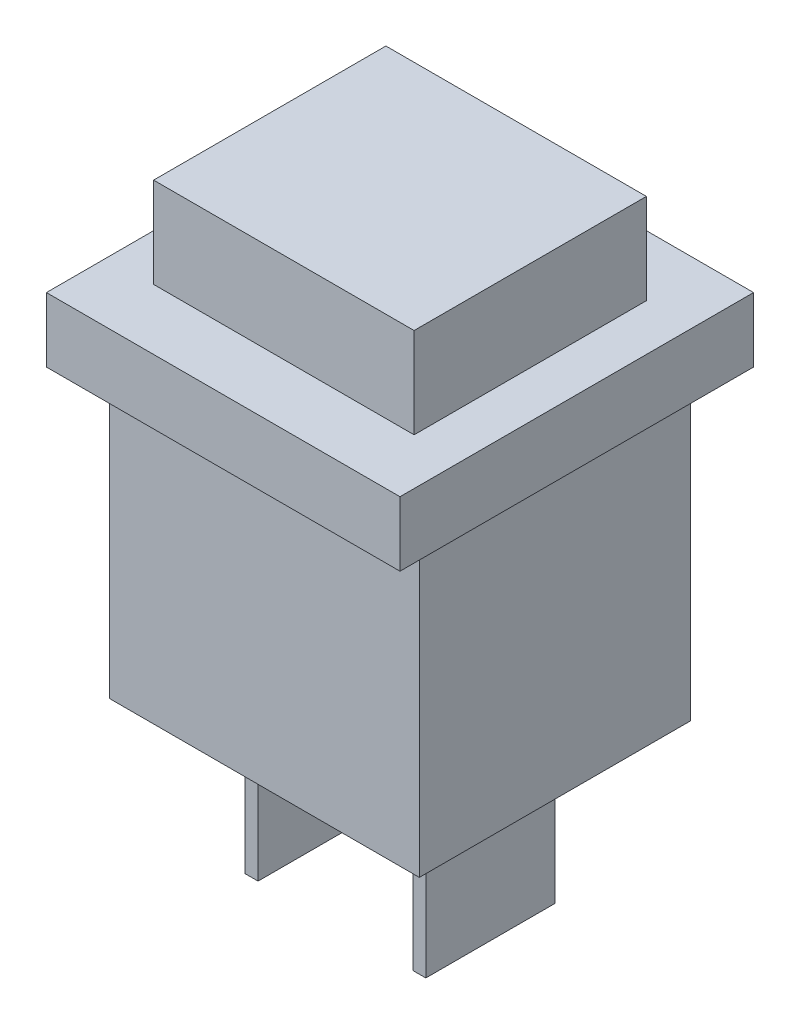
ISO-10303-21;
HEADER;
FILE_DESCRIPTION(('STEP AP214'),'2;1');
FILE_NAME('part.step','',(''),(''),'','','');
FILE_SCHEMA(('AUTOMOTIVE_DESIGN { 1 0 10303 214 1 1 1 1 }'));
ENDSEC;
DATA;
#1=APPLICATION_CONTEXT('core data for automotive mechanical design processes');
#2=APPLICATION_PROTOCOL_DEFINITION('international standard','automotive_design',2000,#1);
#3=PRODUCT_CONTEXT('',#1,'mechanical');
#4=PRODUCT('Part','Part','',(#3));
#5=PRODUCT_RELATED_PRODUCT_CATEGORY('part','',(#4));
#6=PRODUCT_DEFINITION_FORMATION('','',#4);
#7=PRODUCT_DEFINITION_CONTEXT('part definition',#1,'design');
#8=PRODUCT_DEFINITION('design','',#6,#7);
#9=PRODUCT_DEFINITION_SHAPE('','',#8);
#10=(LENGTH_UNIT() NAMED_UNIT(*) SI_UNIT(.MILLI.,.METRE.));
#11=(NAMED_UNIT(*) PLANE_ANGLE_UNIT() SI_UNIT($,.RADIAN.));
#12=(NAMED_UNIT(*) SI_UNIT($,.STERADIAN.) SOLID_ANGLE_UNIT());
#13=UNCERTAINTY_MEASURE_WITH_UNIT(LENGTH_MEASURE(1.E-05),#10,'distance_accuracy_value','');
#14=(GEOMETRIC_REPRESENTATION_CONTEXT(3) GLOBAL_UNCERTAINTY_ASSIGNED_CONTEXT((#13)) GLOBAL_UNIT_ASSIGNED_CONTEXT((#10,
#11,#12)) REPRESENTATION_CONTEXT('',''));
#15=CARTESIAN_POINT('',(0.,0.,0.));
#16=DIRECTION('',(0.,0.,1.));
#17=DIRECTION('',(1.,0.,0.));
#18=AXIS2_PLACEMENT_3D('',#15,#16,#17);
#19=CARTESIAN_POINT('',(0.953422813249566,17.5,-9.75000000000022));
#20=DIRECTION('',(1.,0.,0.));
#21=DIRECTION('',(0.,0.,-1.));
#22=AXIS2_PLACEMENT_3D('',#19,#20,#21);
#23=PLANE('',#22);
#24=DIRECTION('',(0.,0.,1.));
#25=VECTOR('',#24,1.);
#26=CARTESIAN_POINT('',(0.953422813249566,14.,-9.75000000000022));
#27=LINE('',#26,#25);
#28=CARTESIAN_POINT('',(0.953422813249566,14.,-9.75000000000022));
#29=VERTEX_POINT('',#28);
#30=CARTESIAN_POINT('',(0.953422813249567,14.,-0.749999999999774));
#31=VERTEX_POINT('',#30);
#32=EDGE_CURVE('E107',#29,#31,#27,.T.);
#33=ORIENTED_EDGE('',*,*,#32,.T.);
#34=DIRECTION('',(0.,-1.,0.));
#35=VECTOR('',#34,1.);
#36=CARTESIAN_POINT('',(0.953422813249567,17.5,-0.749999999999774));
#37=LINE('',#36,#35);
#38=CARTESIAN_POINT('',(0.953422813249567,17.5,-0.749999999999774));
#39=VERTEX_POINT('',#38);
#40=EDGE_CURVE('E12',#39,#31,#37,.T.);
#41=ORIENTED_EDGE('',*,*,#40,.F.);
#42=DIRECTION('',(0.,0.,1.));
#43=VECTOR('',#42,1.);
#44=CARTESIAN_POINT('',(0.953422813249566,17.5,-9.75000000000022));
#45=LINE('',#44,#43);
#46=CARTESIAN_POINT('',(0.953422813249566,17.5,-9.75000000000022));
#47=VERTEX_POINT('',#46);
#48=EDGE_CURVE('E95',#47,#39,#45,.T.);
#49=ORIENTED_EDGE('',*,*,#48,.F.);
#50=DIRECTION('',(0.,-1.,0.));
#51=VECTOR('',#50,1.);
#52=CARTESIAN_POINT('',(0.953422813249566,17.5,-9.75000000000022));
#53=LINE('',#52,#51);
#54=EDGE_CURVE('E103',#47,#29,#53,.T.);
#55=ORIENTED_EDGE('',*,*,#54,.T.);
#56=EDGE_LOOP('',(#33,#41,#49,#55));
#57=FACE_BOUND('',#56,.T.);
#58=ADVANCED_FACE('F44',(#57),#23,.F.);
#59=CARTESIAN_POINT('',(0.953422813249567,17.5,-0.749999999999774));
#60=DIRECTION('',(0.,0.,-1.));
#61=DIRECTION('',(-1.,0.,0.));
#62=AXIS2_PLACEMENT_3D('',#59,#60,#61);
#63=PLANE('',#62);
#64=DIRECTION('',(1.,0.,0.));
#65=VECTOR('',#64,1.);
#66=CARTESIAN_POINT('',(0.953422813249567,14.,-0.749999999999774));
#67=LINE('',#66,#65);
#68=CARTESIAN_POINT('',(11.0465771867504,14.,-0.749999999999775));
#69=VERTEX_POINT('',#68);
#70=EDGE_CURVE('E99',#31,#69,#67,.T.);
#71=ORIENTED_EDGE('',*,*,#70,.T.);
#72=DIRECTION('',(0.,-1.,0.));
#73=VECTOR('',#72,1.);
#74=CARTESIAN_POINT('',(11.0465771867504,17.5,-0.749999999999775));
#75=LINE('',#74,#73);
#76=CARTESIAN_POINT('',(11.0465771867504,17.5,-0.749999999999775));
#77=VERTEX_POINT('',#76);
#78=EDGE_CURVE('E52',#77,#69,#75,.T.);
#79=ORIENTED_EDGE('',*,*,#78,.F.);
#80=DIRECTION('',(1.,0.,0.));
#81=VECTOR('',#80,1.);
#82=CARTESIAN_POINT('',(0.953422813249567,17.5,-0.749999999999774));
#83=LINE('',#82,#81);
#84=EDGE_CURVE('E90',#39,#77,#83,.T.);
#85=ORIENTED_EDGE('',*,*,#84,.F.);
#86=ORIENTED_EDGE('',*,*,#40,.T.);
#87=EDGE_LOOP('',(#71,#79,#85,#86));
#88=FACE_BOUND('',#87,.T.);
#89=ADVANCED_FACE('F98',(#88),#63,.F.);
#90=CARTESIAN_POINT('',(11.0465771867504,17.5,-9.75000000000022));
#91=DIRECTION('',(-1.,0.,0.));
#92=DIRECTION('',(0.,0.,1.));
#93=AXIS2_PLACEMENT_3D('',#90,#91,#92);
#94=PLANE('',#93);
#95=DIRECTION('',(0.,0.,-1.));
#96=VECTOR('',#95,1.);
#97=CARTESIAN_POINT('',(11.0465771867504,14.,-9.75000000000022));
#98=LINE('',#97,#96);
#99=CARTESIAN_POINT('',(11.0465771867504,14.,-9.75000000000022));
#100=VERTEX_POINT('',#99);
#101=EDGE_CURVE('E77',#69,#100,#98,.T.);
#102=ORIENTED_EDGE('',*,*,#101,.T.);
#103=DIRECTION('',(0.,-1.,0.));
#104=VECTOR('',#103,1.);
#105=CARTESIAN_POINT('',(11.0465771867504,17.5,-9.75000000000022));
#106=LINE('',#105,#104);
#107=CARTESIAN_POINT('',(11.0465771867504,17.5,-9.75000000000022));
#108=VERTEX_POINT('',#107);
#109=EDGE_CURVE('E100',#108,#100,#106,.T.);
#110=ORIENTED_EDGE('',*,*,#109,.F.);
#111=DIRECTION('',(0.,0.,-1.));
#112=VECTOR('',#111,1.);
#113=CARTESIAN_POINT('',(11.0465771867504,17.5,-9.75000000000022));
#114=LINE('',#113,#112);
#115=EDGE_CURVE('E93',#77,#108,#114,.T.);
#116=ORIENTED_EDGE('',*,*,#115,.F.);
#117=ORIENTED_EDGE('',*,*,#78,.T.);
#118=EDGE_LOOP('',(#102,#110,#116,#117));
#119=FACE_BOUND('',#118,.T.);
#120=ADVANCED_FACE('F101',(#119),#94,.F.);
#121=CARTESIAN_POINT('',(0.953422813249566,17.5,-9.75000000000022));
#122=DIRECTION('',(0.,0.,1.));
#123=DIRECTION('',(1.,0.,0.));
#124=AXIS2_PLACEMENT_3D('',#121,#122,#123);
#125=PLANE('',#124);
#126=DIRECTION('',(-1.,0.,0.));
#127=VECTOR('',#126,1.);
#128=CARTESIAN_POINT('',(0.953422813249566,14.,-9.75000000000022));
#129=LINE('',#128,#127);
#130=EDGE_CURVE('E83',#100,#29,#129,.T.);
#131=ORIENTED_EDGE('',*,*,#130,.T.);
#132=ORIENTED_EDGE('',*,*,#54,.F.);
#133=DIRECTION('',(-1.,0.,0.));
#134=VECTOR('',#133,1.);
#135=CARTESIAN_POINT('',(0.953422813249566,17.5,-9.75000000000022));
#136=LINE('',#135,#134);
#137=EDGE_CURVE('E60',#108,#47,#136,.T.);
#138=ORIENTED_EDGE('',*,*,#137,.F.);
#139=ORIENTED_EDGE('',*,*,#109,.T.);
#140=EDGE_LOOP('',(#131,#132,#138,#139));
#141=FACE_BOUND('',#140,.T.);
#142=ADVANCED_FACE('F114',(#141),#125,.F.);
#143=CARTESIAN_POINT('',(0.,17.5,0.));
#144=DIRECTION('',(0.,1.,0.));
#145=DIRECTION('',(0.,0.,1.));
#146=AXIS2_PLACEMENT_3D('',#143,#144,#145);
#147=PLANE('',#146);
#148=ORIENTED_EDGE('',*,*,#48,.T.);
#149=ORIENTED_EDGE('',*,*,#84,.T.);
#150=ORIENTED_EDGE('',*,*,#115,.T.);
#151=ORIENTED_EDGE('',*,*,#137,.T.);
#152=EDGE_LOOP('',(#148,#149,#150,#151));
#153=FACE_BOUND('',#152,.T.);
#154=ADVANCED_FACE('F91',(#153),#147,.T.);
#155=CARTESIAN_POINT('',(0.,14.,0.));
#156=DIRECTION('',(0.,1.,0.));
#157=DIRECTION('',(0.,0.,1.));
#158=AXIS2_PLACEMENT_3D('',#155,#156,#157);
#159=PLANE('',#158);
#160=ORIENTED_EDGE('',*,*,#32,.F.);
#161=ORIENTED_EDGE('',*,*,#130,.F.);
#162=ORIENTED_EDGE('',*,*,#101,.F.);
#163=ORIENTED_EDGE('',*,*,#70,.F.);
#164=EDGE_LOOP('',(#160,#161,#162,#163));
#165=FACE_BOUND('',#164,.T.);
#166=ADVANCED_FACE('F117',(#165),#159,.F.);
#167=CLOSED_SHELL('',(#58,#89,#120,#142,#154,#166));
#168=MANIFOLD_SOLID_BREP('B2',#167);
#169=CARTESIAN_POINT('',(0.,0.,0.));
#170=DIRECTION('',(0.,-1.,0.));
#171=DIRECTION('',(0.,0.,-1.));
#172=AXIS2_PLACEMENT_3D('',#169,#170,#171);
#173=PLANE('',#172);
#174=DIRECTION('',(0.,0.,1.));
#175=VECTOR('',#174,1.);
#176=CARTESIAN_POINT('',(0.,0.,0.));
#177=LINE('',#176,#175);
#178=CARTESIAN_POINT('',(0.,0.,-10.5));
#179=VERTEX_POINT('',#178);
#180=CARTESIAN_POINT('',(0.,0.,0.));
#181=VERTEX_POINT('',#180);
#182=EDGE_CURVE('E368',#179,#181,#177,.T.);
#183=ORIENTED_EDGE('',*,*,#182,.F.);
#184=DIRECTION('',(-1.,0.,0.));
#185=VECTOR('',#184,1.);
#186=CARTESIAN_POINT('',(0.,0.,-10.5));
#187=LINE('',#186,#185);
#188=CARTESIAN_POINT('',(12.,0.,-10.5));
#189=VERTEX_POINT('',#188);
#190=EDGE_CURVE('E373',#189,#179,#187,.T.);
#191=ORIENTED_EDGE('',*,*,#190,.F.);
#192=DIRECTION('',(0.,0.,-1.));
#193=VECTOR('',#192,1.);
#194=CARTESIAN_POINT('',(12.,0.,0.));
#195=LINE('',#194,#193);
#196=CARTESIAN_POINT('',(12.,0.,0.));
#197=VERTEX_POINT('',#196);
#198=EDGE_CURVE('E387',#197,#189,#195,.T.);
#199=ORIENTED_EDGE('',*,*,#198,.F.);
#200=DIRECTION('',(1.,0.,0.));
#201=VECTOR('',#200,1.);
#202=CARTESIAN_POINT('',(0.,0.,0.));
#203=LINE('',#202,#201);
#204=EDGE_CURVE('E385',#181,#197,#203,.T.);
#205=ORIENTED_EDGE('',*,*,#204,.F.);
#206=EDGE_LOOP('',(#183,#191,#199,#205));
#207=FACE_BOUND('',#206,.T.);
#208=DIRECTION('',(1.,0.,0.));
#209=VECTOR('',#208,1.);
#210=CARTESIAN_POINT('',(9.,0.,-7.75));
#211=LINE('',#210,#209);
#212=CARTESIAN_POINT('',(9.,0.,-7.75));
#213=VERTEX_POINT('',#212);
#214=CARTESIAN_POINT('',(9.5,0.,-7.75));
#215=VERTEX_POINT('',#214);
#216=EDGE_CURVE('E310',#213,#215,#211,.T.);
#217=ORIENTED_EDGE('',*,*,#216,.F.);
#218=DIRECTION('',(0.,0.,-1.));
#219=VECTOR('',#218,1.);
#220=CARTESIAN_POINT('',(9.,0.,-2.75));
#221=LINE('',#220,#219);
#222=CARTESIAN_POINT('',(9.,0.,-2.75));
#223=VERTEX_POINT('',#222);
#224=EDGE_CURVE('E307',#223,#213,#221,.T.);
#225=ORIENTED_EDGE('',*,*,#224,.F.);
#226=DIRECTION('',(-1.,0.,0.));
#227=VECTOR('',#226,1.);
#228=CARTESIAN_POINT('',(9.,0.,-2.75));
#229=LINE('',#228,#227);
#230=CARTESIAN_POINT('',(9.5,0.,-2.75));
#231=VERTEX_POINT('',#230);
#232=EDGE_CURVE('E319',#231,#223,#229,.T.);
#233=ORIENTED_EDGE('',*,*,#232,.F.);
#234=DIRECTION('',(0.,0.,1.));
#235=VECTOR('',#234,1.);
#236=CARTESIAN_POINT('',(9.5,0.,-2.75));
#237=LINE('',#236,#235);
#238=EDGE_CURVE('E327',#215,#231,#237,.T.);
#239=ORIENTED_EDGE('',*,*,#238,.F.);
#240=EDGE_LOOP('',(#217,#225,#233,#239));
#241=FACE_BOUND('',#240,.T.);
#242=DIRECTION('',(1.,0.,0.));
#243=VECTOR('',#242,1.);
#244=CARTESIAN_POINT('',(2.5,0.,-7.75));
#245=LINE('',#244,#243);
#246=CARTESIAN_POINT('',(2.5,0.,-7.75));
#247=VERTEX_POINT('',#246);
#248=CARTESIAN_POINT('',(3.,0.,-7.75));
#249=VERTEX_POINT('',#248);
#250=EDGE_CURVE('E619',#247,#249,#245,.T.);
#251=ORIENTED_EDGE('',*,*,#250,.F.);
#252=DIRECTION('',(0.,0.,-1.));
#253=VECTOR('',#252,1.);
#254=CARTESIAN_POINT('',(2.5,0.,-2.75));
#255=LINE('',#254,#253);
#256=CARTESIAN_POINT('',(2.5,0.,-2.75));
#257=VERTEX_POINT('',#256);
#258=EDGE_CURVE('E305',#257,#247,#255,.T.);
#259=ORIENTED_EDGE('',*,*,#258,.F.);
#260=DIRECTION('',(-1.,0.,0.));
#261=VECTOR('',#260,1.);
#262=CARTESIAN_POINT('',(2.5,0.,-2.75));
#263=LINE('',#262,#261);
#264=CARTESIAN_POINT('',(3.,0.,-2.75));
#265=VERTEX_POINT('',#264);
#266=EDGE_CURVE('E301',#265,#257,#263,.T.);
#267=ORIENTED_EDGE('',*,*,#266,.F.);
#268=DIRECTION('',(0.,0.,1.));
#269=VECTOR('',#268,1.);
#270=CARTESIAN_POINT('',(3.,0.,-2.75));
#271=LINE('',#270,#269);
#272=EDGE_CURVE('E616',#249,#265,#271,.T.);
#273=ORIENTED_EDGE('',*,*,#272,.F.);
#274=EDGE_LOOP('',(#251,#259,#267,#273));
#275=FACE_BOUND('',#274,.T.);
#276=ADVANCED_FACE('F168',(#207,#241,#275),#173,.T.);
#277=CARTESIAN_POINT('',(0.,11.5,0.));
#278=DIRECTION('',(1.,0.,0.));
#279=DIRECTION('',(0.,0.,-1.));
#280=AXIS2_PLACEMENT_3D('',#277,#278,#279);
#281=PLANE('',#280);
#282=ORIENTED_EDGE('',*,*,#182,.T.);
#283=DIRECTION('',(0.,-1.,0.));
#284=VECTOR('',#283,1.);
#285=CARTESIAN_POINT('',(0.,11.5,0.));
#286=LINE('',#285,#284);
#287=CARTESIAN_POINT('',(0.,11.5,0.));
#288=VERTEX_POINT('',#287);
#289=EDGE_CURVE('E42',#288,#181,#286,.T.);
#290=ORIENTED_EDGE('',*,*,#289,.F.);
#291=DIRECTION('',(0.,0.,1.));
#292=VECTOR('',#291,1.);
#293=CARTESIAN_POINT('',(0.,11.5,0.));
#294=LINE('',#293,#292);
#295=CARTESIAN_POINT('',(0.,11.5,-10.5));
#296=VERTEX_POINT('',#295);
#297=EDGE_CURVE('E369',#296,#288,#294,.T.);
#298=ORIENTED_EDGE('',*,*,#297,.F.);
#299=DIRECTION('',(0.,-1.,0.));
#300=VECTOR('',#299,1.);
#301=CARTESIAN_POINT('',(0.,11.5,-10.5));
#302=LINE('',#301,#300);
#303=EDGE_CURVE('E382',#296,#179,#302,.T.);
#304=ORIENTED_EDGE('',*,*,#303,.T.);
#305=EDGE_LOOP('',(#282,#290,#298,#304));
#306=FACE_BOUND('',#305,.T.);
#307=ADVANCED_FACE('F170',(#306),#281,.F.);
#308=CARTESIAN_POINT('',(0.,11.5,0.));
#309=DIRECTION('',(0.,0.,-1.));
#310=DIRECTION('',(-1.,0.,0.));
#311=AXIS2_PLACEMENT_3D('',#308,#309,#310);
#312=PLANE('',#311);
#313=ORIENTED_EDGE('',*,*,#204,.T.);
#314=DIRECTION('',(0.,-1.,0.));
#315=VECTOR('',#314,1.);
#316=CARTESIAN_POINT('',(12.,11.5,0.));
#317=LINE('',#316,#315);
#318=CARTESIAN_POINT('',(12.,11.5,0.));
#319=VERTEX_POINT('',#318);
#320=EDGE_CURVE('E176',#319,#197,#317,.T.);
#321=ORIENTED_EDGE('',*,*,#320,.F.);
#322=DIRECTION('',(1.,0.,0.));
#323=VECTOR('',#322,1.);
#324=CARTESIAN_POINT('',(0.,11.5,0.));
#325=LINE('',#324,#323);
#326=EDGE_CURVE('E372',#288,#319,#325,.T.);
#327=ORIENTED_EDGE('',*,*,#326,.F.);
#328=ORIENTED_EDGE('',*,*,#289,.T.);
#329=EDGE_LOOP('',(#313,#321,#327,#328));
#330=FACE_BOUND('',#329,.T.);
#331=ADVANCED_FACE('F412',(#330),#312,.F.);
#332=CARTESIAN_POINT('',(12.,11.5,0.));
#333=DIRECTION('',(-1.,0.,0.));
#334=DIRECTION('',(0.,0.,1.));
#335=AXIS2_PLACEMENT_3D('',#332,#333,#334);
#336=PLANE('',#335);
#337=ORIENTED_EDGE('',*,*,#198,.T.);
#338=DIRECTION('',(0.,-1.,0.));
#339=VECTOR('',#338,1.);
#340=CARTESIAN_POINT('',(12.,11.5,-10.5));
#341=LINE('',#340,#339);
#342=CARTESIAN_POINT('',(12.,11.5,-10.5));
#343=VERTEX_POINT('',#342);
#344=EDGE_CURVE('E392',#343,#189,#341,.T.);
#345=ORIENTED_EDGE('',*,*,#344,.F.);
#346=DIRECTION('',(0.,0.,-1.));
#347=VECTOR('',#346,1.);
#348=CARTESIAN_POINT('',(12.,11.5,0.));
#349=LINE('',#348,#347);
#350=EDGE_CURVE('E376',#319,#343,#349,.T.);
#351=ORIENTED_EDGE('',*,*,#350,.F.);
#352=ORIENTED_EDGE('',*,*,#320,.T.);
#353=EDGE_LOOP('',(#337,#345,#351,#352));
#354=FACE_BOUND('',#353,.T.);
#355=ADVANCED_FACE('F398',(#354),#336,.F.);
#356=CARTESIAN_POINT('',(0.,11.5,-10.5));
#357=DIRECTION('',(0.,0.,1.));
#358=DIRECTION('',(1.,0.,0.));
#359=AXIS2_PLACEMENT_3D('',#356,#357,#358);
#360=PLANE('',#359);
#361=ORIENTED_EDGE('',*,*,#190,.T.);
#362=ORIENTED_EDGE('',*,*,#303,.F.);
#363=DIRECTION('',(-1.,0.,0.));
#364=VECTOR('',#363,1.);
#365=CARTESIAN_POINT('',(0.,11.5,-10.5));
#366=LINE('',#365,#364);
#367=EDGE_CURVE('E379',#343,#296,#366,.T.);
#368=ORIENTED_EDGE('',*,*,#367,.F.);
#369=ORIENTED_EDGE('',*,*,#344,.T.);
#370=EDGE_LOOP('',(#361,#362,#368,#369));
#371=FACE_BOUND('',#370,.T.);
#372=ADVANCED_FACE('F406',(#371),#360,.F.);
#373=CARTESIAN_POINT('',(0.,11.5,0.));
#374=DIRECTION('',(0.,1.,0.));
#375=DIRECTION('',(0.,0.,1.));
#376=AXIS2_PLACEMENT_3D('',#373,#374,#375);
#377=PLANE('',#376);
#378=DIRECTION('',(0.,0.,-1.));
#379=VECTOR('',#378,1.);
#380=CARTESIAN_POINT('',(12.85,11.5,1.6));
#381=LINE('',#380,#379);
#382=CARTESIAN_POINT('',(12.85,11.5,1.6));
#383=VERTEX_POINT('',#382);
#384=CARTESIAN_POINT('',(12.85,11.5,-12.1));
#385=VERTEX_POINT('',#384);
#386=EDGE_CURVE('E338',#383,#385,#381,.T.);
#387=ORIENTED_EDGE('',*,*,#386,.F.);
#388=DIRECTION('',(1.,0.,0.));
#389=VECTOR('',#388,1.);
#390=CARTESIAN_POINT('',(12.85,11.5,1.6));
#391=LINE('',#390,#389);
#392=CARTESIAN_POINT('',(-0.849999999999998,11.5,1.6));
#393=VERTEX_POINT('',#392);
#394=EDGE_CURVE('E343',#393,#383,#391,.T.);
#395=ORIENTED_EDGE('',*,*,#394,.F.);
#396=DIRECTION('',(0.,0.,1.));
#397=VECTOR('',#396,1.);
#398=CARTESIAN_POINT('',(-0.849999999999998,11.5,1.6));
#399=LINE('',#398,#397);
#400=CARTESIAN_POINT('',(-0.849999999999998,11.5,-12.1));
#401=VERTEX_POINT('',#400);
#402=EDGE_CURVE('E354',#401,#393,#399,.T.);
#403=ORIENTED_EDGE('',*,*,#402,.F.);
#404=DIRECTION('',(-1.,0.,0.));
#405=VECTOR('',#404,1.);
#406=CARTESIAN_POINT('',(12.85,11.5,-12.1));
#407=LINE('',#406,#405);
#408=EDGE_CURVE('E352',#385,#401,#407,.T.);
#409=ORIENTED_EDGE('',*,*,#408,.F.);
#410=EDGE_LOOP('',(#387,#395,#403,#409));
#411=FACE_BOUND('',#410,.T.);
#412=ORIENTED_EDGE('',*,*,#367,.T.);
#413=ORIENTED_EDGE('',*,*,#297,.T.);
#414=ORIENTED_EDGE('',*,*,#326,.T.);
#415=ORIENTED_EDGE('',*,*,#350,.T.);
#416=EDGE_LOOP('',(#412,#413,#414,#415));
#417=FACE_BOUND('',#416,.T.);
#418=ADVANCED_FACE('F411',(#411,#417),#377,.F.);
#419=CARTESIAN_POINT('',(12.85,14.,1.6));
#420=DIRECTION('',(-1.,0.,0.));
#421=DIRECTION('',(0.,0.,1.));
#422=AXIS2_PLACEMENT_3D('',#419,#420,#421);
#423=PLANE('',#422);
#424=ORIENTED_EDGE('',*,*,#386,.T.);
#425=DIRECTION('',(0.,-1.,0.));
#426=VECTOR('',#425,1.);
#427=CARTESIAN_POINT('',(12.85,14.,-12.1));
#428=LINE('',#427,#426);
#429=CARTESIAN_POINT('',(12.85,14.,-12.1));
#430=VERTEX_POINT('',#429);
#431=EDGE_CURVE('E365',#430,#385,#428,.T.);
#432=ORIENTED_EDGE('',*,*,#431,.F.);
#433=DIRECTION('',(0.,0.,-1.));
#434=VECTOR('',#433,1.);
#435=CARTESIAN_POINT('',(12.85,14.,1.6));
#436=LINE('',#435,#434);
#437=CARTESIAN_POINT('',(12.85,14.,1.6));
#438=VERTEX_POINT('',#437);
#439=EDGE_CURVE('E339',#438,#430,#436,.T.);
#440=ORIENTED_EDGE('',*,*,#439,.F.);
#441=DIRECTION('',(0.,-1.,0.));
#442=VECTOR('',#441,1.);
#443=CARTESIAN_POINT('',(12.85,14.,1.6));
#444=LINE('',#443,#442);
#445=EDGE_CURVE('E349',#438,#383,#444,.T.);
#446=ORIENTED_EDGE('',*,*,#445,.T.);
#447=EDGE_LOOP('',(#424,#432,#440,#446));
#448=FACE_BOUND('',#447,.T.);
#449=ADVANCED_FACE('F425',(#448),#423,.F.);
#450=CARTESIAN_POINT('',(12.85,14.,-12.1));
#451=DIRECTION('',(0.,0.,1.));
#452=DIRECTION('',(1.,0.,0.));
#453=AXIS2_PLACEMENT_3D('',#450,#451,#452);
#454=PLANE('',#453);
#455=ORIENTED_EDGE('',*,*,#408,.T.);
#456=DIRECTION('',(0.,-1.,0.));
#457=VECTOR('',#456,1.);
#458=CARTESIAN_POINT('',(-0.849999999999998,14.,-12.1));
#459=LINE('',#458,#457);
#460=CARTESIAN_POINT('',(-0.849999999999998,14.,-12.1));
#461=VERTEX_POINT('',#460);
#462=EDGE_CURVE('E362',#461,#401,#459,.T.);
#463=ORIENTED_EDGE('',*,*,#462,.F.);
#464=DIRECTION('',(-1.,0.,0.));
#465=VECTOR('',#464,1.);
#466=CARTESIAN_POINT('',(12.85,14.,-12.1));
#467=LINE('',#466,#465);
#468=EDGE_CURVE('E342',#430,#461,#467,.T.);
#469=ORIENTED_EDGE('',*,*,#468,.F.);
#470=ORIENTED_EDGE('',*,*,#431,.T.);
#471=EDGE_LOOP('',(#455,#463,#469,#470));
#472=FACE_BOUND('',#471,.T.);
#473=ADVANCED_FACE('F436',(#472),#454,.F.);
#474=CARTESIAN_POINT('',(-0.849999999999998,14.,1.6));
#475=DIRECTION('',(1.,0.,0.));
#476=DIRECTION('',(0.,0.,-1.));
#477=AXIS2_PLACEMENT_3D('',#474,#475,#476);
#478=PLANE('',#477);
#479=ORIENTED_EDGE('',*,*,#402,.T.);
#480=DIRECTION('',(0.,-1.,0.));
#481=VECTOR('',#480,1.);
#482=CARTESIAN_POINT('',(-0.849999999999998,14.,1.6));
#483=LINE('',#482,#481);
#484=CARTESIAN_POINT('',(-0.849999999999998,14.,1.6));
#485=VERTEX_POINT('',#484);
#486=EDGE_CURVE('E359',#485,#393,#483,.T.);
#487=ORIENTED_EDGE('',*,*,#486,.F.);
#488=DIRECTION('',(0.,0.,1.));
#489=VECTOR('',#488,1.);
#490=CARTESIAN_POINT('',(-0.849999999999998,14.,1.6));
#491=LINE('',#490,#489);
#492=EDGE_CURVE('E345',#461,#485,#491,.T.);
#493=ORIENTED_EDGE('',*,*,#492,.F.);
#494=ORIENTED_EDGE('',*,*,#462,.T.);
#495=EDGE_LOOP('',(#479,#487,#493,#494));
#496=FACE_BOUND('',#495,.T.);
#497=ADVANCED_FACE('F446',(#496),#478,.F.);
#498=CARTESIAN_POINT('',(12.85,14.,1.6));
#499=DIRECTION('',(0.,0.,-1.));
#500=DIRECTION('',(-1.,0.,0.));
#501=AXIS2_PLACEMENT_3D('',#498,#499,#500);
#502=PLANE('',#501);
#503=ORIENTED_EDGE('',*,*,#394,.T.);
#504=ORIENTED_EDGE('',*,*,#445,.F.);
#505=DIRECTION('',(1.,0.,0.));
#506=VECTOR('',#505,1.);
#507=CARTESIAN_POINT('',(12.85,14.,1.6));
#508=LINE('',#507,#506);
#509=EDGE_CURVE('E347',#485,#438,#508,.T.);
#510=ORIENTED_EDGE('',*,*,#509,.F.);
#511=ORIENTED_EDGE('',*,*,#486,.T.);
#512=EDGE_LOOP('',(#503,#504,#510,#511));
#513=FACE_BOUND('',#512,.T.);
#514=ADVANCED_FACE('F443',(#513),#502,.F.);
#515=CARTESIAN_POINT('',(0.,14.,0.));
#516=DIRECTION('',(0.,1.,0.));
#517=DIRECTION('',(0.,0.,1.));
#518=AXIS2_PLACEMENT_3D('',#515,#516,#517);
#519=PLANE('',#518);
#520=ORIENTED_EDGE('',*,*,#439,.T.);
#521=ORIENTED_EDGE('',*,*,#468,.T.);
#522=ORIENTED_EDGE('',*,*,#492,.T.);
#523=ORIENTED_EDGE('',*,*,#509,.T.);
#524=EDGE_LOOP('',(#520,#521,#522,#523));
#525=FACE_BOUND('',#524,.T.);
#526=ADVANCED_FACE('F441',(#525),#519,.T.);
#527=CARTESIAN_POINT('',(9.,-6.,-2.75));
#528=DIRECTION('',(1.,0.,0.));
#529=DIRECTION('',(0.,0.,-1.));
#530=AXIS2_PLACEMENT_3D('',#527,#528,#529);
#531=PLANE('',#530);
#532=ORIENTED_EDGE('',*,*,#224,.T.);
#533=DIRECTION('',(0.,1.,0.));
#534=VECTOR('',#533,1.);
#535=CARTESIAN_POINT('',(9.,-6.,-7.75));
#536=LINE('',#535,#534);
#537=CARTESIAN_POINT('',(9.,-6.,-7.75));
#538=VERTEX_POINT('',#537);
#539=EDGE_CURVE('E336',#538,#213,#536,.T.);
#540=ORIENTED_EDGE('',*,*,#539,.F.);
#541=DIRECTION('',(0.,0.,-1.));
#542=VECTOR('',#541,1.);
#543=CARTESIAN_POINT('',(9.,-6.,-2.75));
#544=LINE('',#543,#542);
#545=CARTESIAN_POINT('',(9.,-6.,-2.75));
#546=VERTEX_POINT('',#545);
#547=EDGE_CURVE('E315',#546,#538,#544,.T.);
#548=ORIENTED_EDGE('',*,*,#547,.F.);
#549=DIRECTION('',(0.,1.,0.));
#550=VECTOR('',#549,1.);
#551=CARTESIAN_POINT('',(9.,-6.,-2.75));
#552=LINE('',#551,#550);
#553=EDGE_CURVE('E324',#546,#223,#552,.T.);
#554=ORIENTED_EDGE('',*,*,#553,.T.);
#555=EDGE_LOOP('',(#532,#540,#548,#554));
#556=FACE_BOUND('',#555,.T.);
#557=ADVANCED_FACE('F465',(#556),#531,.F.);
#558=CARTESIAN_POINT('',(9.,-6.,-7.75));
#559=DIRECTION('',(0.,0.,1.));
#560=DIRECTION('',(1.,0.,0.));
#561=AXIS2_PLACEMENT_3D('',#558,#559,#560);
#562=PLANE('',#561);
#563=ORIENTED_EDGE('',*,*,#216,.T.);
#564=DIRECTION('',(0.,1.,0.));
#565=VECTOR('',#564,1.);
#566=CARTESIAN_POINT('',(9.5,-6.,-7.75));
#567=LINE('',#566,#565);
#568=CARTESIAN_POINT('',(9.5,-6.,-7.75));
#569=VERTEX_POINT('',#568);
#570=EDGE_CURVE('E333',#569,#215,#567,.T.);
#571=ORIENTED_EDGE('',*,*,#570,.F.);
#572=DIRECTION('',(1.,0.,0.));
#573=VECTOR('',#572,1.);
#574=CARTESIAN_POINT('',(9.,-6.,-7.75));
#575=LINE('',#574,#573);
#576=EDGE_CURVE('E318',#538,#569,#575,.T.);
#577=ORIENTED_EDGE('',*,*,#576,.F.);
#578=ORIENTED_EDGE('',*,*,#539,.T.);
#579=EDGE_LOOP('',(#563,#571,#577,#578));
#580=FACE_BOUND('',#579,.T.);
#581=ADVANCED_FACE('F469',(#580),#562,.F.);
#582=CARTESIAN_POINT('',(9.5,-6.,-2.75));
#583=DIRECTION('',(-1.,0.,0.));
#584=DIRECTION('',(0.,0.,1.));
#585=AXIS2_PLACEMENT_3D('',#582,#583,#584);
#586=PLANE('',#585);
#587=ORIENTED_EDGE('',*,*,#238,.T.);
#588=DIRECTION('',(0.,1.,0.));
#589=VECTOR('',#588,1.);
#590=CARTESIAN_POINT('',(9.5,-6.,-2.75));
#591=LINE('',#590,#589);
#592=CARTESIAN_POINT('',(9.5,-6.,-2.75));
#593=VERTEX_POINT('',#592);
#594=EDGE_CURVE('E191',#593,#231,#591,.T.);
#595=ORIENTED_EDGE('',*,*,#594,.F.);
#596=DIRECTION('',(0.,0.,1.));
#597=VECTOR('',#596,1.);
#598=CARTESIAN_POINT('',(9.5,-6.,-2.75));
#599=LINE('',#598,#597);
#600=EDGE_CURVE('E321',#569,#593,#599,.T.);
#601=ORIENTED_EDGE('',*,*,#600,.F.);
#602=ORIENTED_EDGE('',*,*,#570,.T.);
#603=EDGE_LOOP('',(#587,#595,#601,#602));
#604=FACE_BOUND('',#603,.T.);
#605=ADVANCED_FACE('F474',(#604),#586,.F.);
#606=CARTESIAN_POINT('',(9.,-6.,-2.75));
#607=DIRECTION('',(0.,0.,-1.));
#608=DIRECTION('',(-1.,0.,0.));
#609=AXIS2_PLACEMENT_3D('',#606,#607,#608);
#610=PLANE('',#609);
#611=ORIENTED_EDGE('',*,*,#232,.T.);
#612=ORIENTED_EDGE('',*,*,#553,.F.);
#613=DIRECTION('',(-1.,0.,0.));
#614=VECTOR('',#613,1.);
#615=CARTESIAN_POINT('',(9.,-6.,-2.75));
#616=LINE('',#615,#614);
#617=EDGE_CURVE('E323',#593,#546,#616,.T.);
#618=ORIENTED_EDGE('',*,*,#617,.F.);
#619=ORIENTED_EDGE('',*,*,#594,.T.);
#620=EDGE_LOOP('',(#611,#612,#618,#619));
#621=FACE_BOUND('',#620,.T.);
#622=ADVANCED_FACE('F480',(#621),#610,.F.);
#623=CARTESIAN_POINT('',(0.,-6.,0.));
#624=DIRECTION('',(0.,-1.,0.));
#625=DIRECTION('',(0.,0.,-1.));
#626=AXIS2_PLACEMENT_3D('',#623,#624,#625);
#627=PLANE('',#626);
#628=ORIENTED_EDGE('',*,*,#547,.T.);
#629=ORIENTED_EDGE('',*,*,#576,.T.);
#630=ORIENTED_EDGE('',*,*,#600,.T.);
#631=ORIENTED_EDGE('',*,*,#617,.T.);
#632=EDGE_LOOP('',(#628,#629,#630,#631));
#633=FACE_BOUND('',#632,.T.);
#634=ADVANCED_FACE('F484',(#633),#627,.T.);
#635=CARTESIAN_POINT('',(2.5,-6.,-2.75));
#636=DIRECTION('',(1.,0.,0.));
#637=DIRECTION('',(0.,0.,-1.));
#638=AXIS2_PLACEMENT_3D('',#635,#636,#637);
#639=PLANE('',#638);
#640=ORIENTED_EDGE('',*,*,#258,.T.);
#641=DIRECTION('',(0.,1.,0.));
#642=VECTOR('',#641,1.);
#643=CARTESIAN_POINT('',(2.5,-6.,-7.75));
#644=LINE('',#643,#642);
#645=CARTESIAN_POINT('',(2.5,-6.,-7.75));
#646=VERTEX_POINT('',#645);
#647=EDGE_CURVE('E286',#646,#247,#644,.T.);
#648=ORIENTED_EDGE('',*,*,#647,.F.);
#649=DIRECTION('',(0.,0.,-1.));
#650=VECTOR('',#649,1.);
#651=CARTESIAN_POINT('',(2.5,-6.,-2.75));
#652=LINE('',#651,#650);
#653=CARTESIAN_POINT('',(2.5,-6.,-2.75));
#654=VERTEX_POINT('',#653);
#655=EDGE_CURVE('E293',#654,#646,#652,.T.);
#656=ORIENTED_EDGE('',*,*,#655,.F.);
#657=DIRECTION('',(0.,1.,0.));
#658=VECTOR('',#657,1.);
#659=CARTESIAN_POINT('',(2.5,-6.,-2.75));
#660=LINE('',#659,#658);
#661=EDGE_CURVE('E613',#654,#257,#660,.T.);
#662=ORIENTED_EDGE('',*,*,#661,.T.);
#663=EDGE_LOOP('',(#640,#648,#656,#662));
#664=FACE_BOUND('',#663,.T.);
#665=ADVANCED_FACE('F303',(#664),#639,.F.);
#666=CARTESIAN_POINT('',(2.5,-6.,-7.75));
#667=DIRECTION('',(0.,0.,1.));
#668=DIRECTION('',(1.,0.,0.));
#669=AXIS2_PLACEMENT_3D('',#666,#667,#668);
#670=PLANE('',#669);
#671=ORIENTED_EDGE('',*,*,#250,.T.);
#672=DIRECTION('',(0.,1.,0.));
#673=VECTOR('',#672,1.);
#674=CARTESIAN_POINT('',(3.,-6.,-7.75));
#675=LINE('',#674,#673);
#676=CARTESIAN_POINT('',(3.,-6.,-7.75));
#677=VERTEX_POINT('',#676);
#678=EDGE_CURVE('E289',#677,#249,#675,.T.);
#679=ORIENTED_EDGE('',*,*,#678,.F.);
#680=DIRECTION('',(1.,0.,0.));
#681=VECTOR('',#680,1.);
#682=CARTESIAN_POINT('',(2.5,-6.,-7.75));
#683=LINE('',#682,#681);
#684=EDGE_CURVE('E282',#646,#677,#683,.T.);
#685=ORIENTED_EDGE('',*,*,#684,.F.);
#686=ORIENTED_EDGE('',*,*,#647,.T.);
#687=EDGE_LOOP('',(#671,#679,#685,#686));
#688=FACE_BOUND('',#687,.T.);
#689=ADVANCED_FACE('F284',(#688),#670,.F.);
#690=CARTESIAN_POINT('',(3.,-6.,-2.75));
#691=DIRECTION('',(-1.,0.,0.));
#692=DIRECTION('',(0.,0.,1.));
#693=AXIS2_PLACEMENT_3D('',#690,#691,#692);
#694=PLANE('',#693);
#695=ORIENTED_EDGE('',*,*,#272,.T.);
#696=DIRECTION('',(0.,1.,0.));
#697=VECTOR('',#696,1.);
#698=CARTESIAN_POINT('',(3.,-6.,-2.75));
#699=LINE('',#698,#697);
#700=CARTESIAN_POINT('',(3.,-6.,-2.75));
#701=VERTEX_POINT('',#700);
#702=EDGE_CURVE('E183',#701,#265,#699,.T.);
#703=ORIENTED_EDGE('',*,*,#702,.F.);
#704=DIRECTION('',(0.,0.,1.));
#705=VECTOR('',#704,1.);
#706=CARTESIAN_POINT('',(3.,-6.,-2.75));
#707=LINE('',#706,#705);
#708=EDGE_CURVE('E292',#677,#701,#707,.T.);
#709=ORIENTED_EDGE('',*,*,#708,.F.);
#710=ORIENTED_EDGE('',*,*,#678,.T.);
#711=EDGE_LOOP('',(#695,#703,#709,#710));
#712=FACE_BOUND('',#711,.T.);
#713=ADVANCED_FACE('F492',(#712),#694,.F.);
#714=CARTESIAN_POINT('',(2.5,-6.,-2.75));
#715=DIRECTION('',(0.,0.,-1.));
#716=DIRECTION('',(-1.,0.,0.));
#717=AXIS2_PLACEMENT_3D('',#714,#715,#716);
#718=PLANE('',#717);
#719=ORIENTED_EDGE('',*,*,#266,.T.);
#720=ORIENTED_EDGE('',*,*,#661,.F.);
#721=DIRECTION('',(-1.,0.,0.));
#722=VECTOR('',#721,1.);
#723=CARTESIAN_POINT('',(2.5,-6.,-2.75));
#724=LINE('',#723,#722);
#725=EDGE_CURVE('E297',#701,#654,#724,.T.);
#726=ORIENTED_EDGE('',*,*,#725,.F.);
#727=ORIENTED_EDGE('',*,*,#702,.T.);
#728=EDGE_LOOP('',(#719,#720,#726,#727));
#729=FACE_BOUND('',#728,.T.);
#730=ADVANCED_FACE('F495',(#729),#718,.F.);
#731=CARTESIAN_POINT('',(0.,-6.,0.));
#732=DIRECTION('',(0.,-1.,0.));
#733=DIRECTION('',(0.,0.,-1.));
#734=AXIS2_PLACEMENT_3D('',#731,#732,#733);
#735=PLANE('',#734);
#736=ORIENTED_EDGE('',*,*,#655,.T.);
#737=ORIENTED_EDGE('',*,*,#684,.T.);
#738=ORIENTED_EDGE('',*,*,#708,.T.);
#739=ORIENTED_EDGE('',*,*,#725,.T.);
#740=EDGE_LOOP('',(#736,#737,#738,#739));
#741=FACE_BOUND('',#740,.T.);
#742=ADVANCED_FACE('F296',(#741),#735,.T.);
#743=CLOSED_SHELL('',(#276,#307,#331,#355,#372,#418,#449,#473,#497,#514,#526,#557,#581,#605,
#622,#634,#665,#689,#713,#730,#742));
#744=MANIFOLD_SOLID_BREP('B6',#743);
#745=ADVANCED_BREP_SHAPE_REPRESENTATION('',(#18,#168,#744),#14);
#746=SHAPE_DEFINITION_REPRESENTATION(#9,#745);
ENDSEC;
END-ISO-10303-21;
